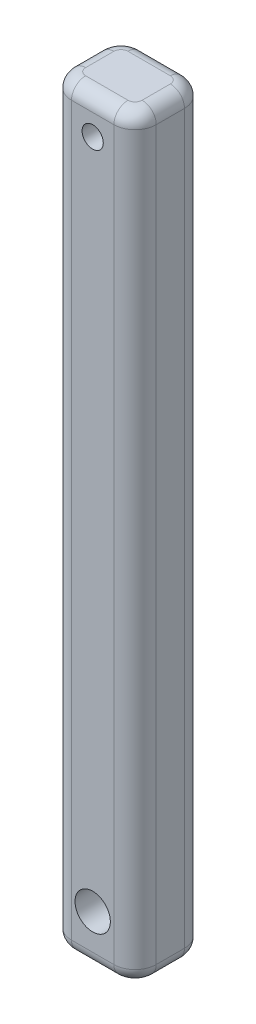
ISO-10303-21;
HEADER;
FILE_DESCRIPTION(('STEP AP214'),'2;1');
FILE_NAME('part.step','',(''),(''),'','','');
FILE_SCHEMA(('AUTOMOTIVE_DESIGN { 1 0 10303 214 1 1 1 1 }'));
ENDSEC;
DATA;
#1=APPLICATION_CONTEXT('core data for automotive mechanical design processes');
#2=APPLICATION_PROTOCOL_DEFINITION('international standard','automotive_design',2000,#1);
#3=PRODUCT_CONTEXT('',#1,'mechanical');
#4=PRODUCT('Part','Part','',(#3));
#5=PRODUCT_RELATED_PRODUCT_CATEGORY('part','',(#4));
#6=PRODUCT_DEFINITION_FORMATION('','',#4);
#7=PRODUCT_DEFINITION_CONTEXT('part definition',#1,'design');
#8=PRODUCT_DEFINITION('design','',#6,#7);
#9=PRODUCT_DEFINITION_SHAPE('','',#8);
#10=(LENGTH_UNIT() NAMED_UNIT(*) SI_UNIT(.MILLI.,.METRE.));
#11=(NAMED_UNIT(*) PLANE_ANGLE_UNIT() SI_UNIT($,.RADIAN.));
#12=(NAMED_UNIT(*) SI_UNIT($,.STERADIAN.) SOLID_ANGLE_UNIT());
#13=UNCERTAINTY_MEASURE_WITH_UNIT(LENGTH_MEASURE(1.E-05),#10,'distance_accuracy_value','');
#14=(GEOMETRIC_REPRESENTATION_CONTEXT(3) GLOBAL_UNCERTAINTY_ASSIGNED_CONTEXT((#13)) GLOBAL_UNIT_ASSIGNED_CONTEXT((#10,
#11,#12)) REPRESENTATION_CONTEXT('',''));
#15=CARTESIAN_POINT('',(0.,0.,0.));
#16=DIRECTION('',(0.,0.,1.));
#17=DIRECTION('',(1.,0.,0.));
#18=AXIS2_PLACEMENT_3D('',#15,#16,#17);
#19=CARTESIAN_POINT('',(-7.61999999999996,271.78,5.08));
#20=DIRECTION('',(0.,-1.,0.));
#21=DIRECTION('',(0.,0.,-1.));
#22=AXIS2_PLACEMENT_3D('',#19,#20,#21);
#23=CYLINDRICAL_SURFACE('',#22,7.62);
#24=DIRECTION('',(0.,-1.,0.));
#25=VECTOR('',#24,1.);
#26=CARTESIAN_POINT('',(-15.24,271.78,5.08));
#27=LINE('',#26,#25);
#28=CARTESIAN_POINT('',(-15.24,266.7,5.08));
#29=VERTEX_POINT('',#28);
#30=CARTESIAN_POINT('',(-15.24,5.07999999999997,5.08));
#31=VERTEX_POINT('',#30);
#32=EDGE_CURVE('E302',#29,#31,#27,.T.);
#33=ORIENTED_EDGE('',*,*,#32,.T.);
#34=CARTESIAN_POINT('',(-7.61999999999996,5.07999999999997,5.08));
#35=DIRECTION('',(0.,1.,0.));
#36=DIRECTION('',(0.,0.,1.));
#37=AXIS2_PLACEMENT_3D('',#34,#35,#36);
#38=CIRCLE('',#37,7.62);
#39=CARTESIAN_POINT('',(-7.61999999999996,5.07999999999997,12.7));
#40=VERTEX_POINT('',#39);
#41=EDGE_CURVE('E13',#31,#40,#38,.T.);
#42=ORIENTED_EDGE('',*,*,#41,.T.);
#43=DIRECTION('',(0.,-1.,0.));
#44=VECTOR('',#43,1.);
#45=CARTESIAN_POINT('',(-7.61999999999996,271.78,12.7));
#46=LINE('',#45,#44);
#47=CARTESIAN_POINT('',(-7.61999999999996,266.7,12.7));
#48=VERTEX_POINT('',#47);
#49=EDGE_CURVE('E182',#48,#40,#46,.T.);
#50=ORIENTED_EDGE('',*,*,#49,.F.);
#51=CARTESIAN_POINT('',(-7.61999999999996,266.7,5.08));
#52=DIRECTION('',(0.,1.,0.));
#53=DIRECTION('',(0.,0.,1.));
#54=AXIS2_PLACEMENT_3D('',#51,#52,#53);
#55=CIRCLE('',#54,7.62);
#56=EDGE_CURVE('E206',#48,#29,#55,.F.);
#57=ORIENTED_EDGE('',*,*,#56,.T.);
#58=EDGE_LOOP('',(#33,#42,#50,#57));
#59=FACE_BOUND('',#58,.T.);
#60=ADVANCED_FACE('F46',(#59),#23,.T.);
#61=CARTESIAN_POINT('',(-7.61999999999996,271.78,12.7));
#62=DIRECTION('',(0.,0.,-1.));
#63=DIRECTION('',(-1.,0.,0.));
#64=AXIS2_PLACEMENT_3D('',#61,#62,#63);
#65=PLANE('',#64);
#66=CARTESIAN_POINT('',(0.,259.08,12.7));
#67=DIRECTION('',(0.,0.,1.));
#68=DIRECTION('',(1.,0.,0.));
#69=AXIS2_PLACEMENT_3D('',#66,#67,#68);
#70=CIRCLE('',#69,3.81);
#71=CARTESIAN_POINT('',(3.81,259.08,12.7));
#72=VERTEX_POINT('',#71);
#73=EDGE_CURVE('E226',#72,#72,#70,.T.);
#74=ORIENTED_EDGE('',*,*,#73,.F.);
#75=EDGE_LOOP('',(#74));
#76=FACE_BOUND('',#75,.T.);
#77=CARTESIAN_POINT('',(0.,17.78,12.7));
#78=DIRECTION('',(0.,0.,1.));
#79=DIRECTION('',(1.,0.,0.));
#80=AXIS2_PLACEMENT_3D('',#77,#78,#79);
#81=CIRCLE('',#80,6.35);
#82=CARTESIAN_POINT('',(6.35,17.78,12.7));
#83=VERTEX_POINT('',#82);
#84=EDGE_CURVE('E449',#83,#83,#81,.T.);
#85=ORIENTED_EDGE('',*,*,#84,.F.);
#86=EDGE_LOOP('',(#85));
#87=FACE_BOUND('',#86,.T.);
#88=ORIENTED_EDGE('',*,*,#49,.T.);
#89=DIRECTION('',(1.,0.,0.));
#90=VECTOR('',#89,1.);
#91=CARTESIAN_POINT('',(-7.61999999999996,5.07999999999997,12.7));
#92=LINE('',#91,#90);
#93=CARTESIAN_POINT('',(7.61999999999996,5.07999999999997,12.7));
#94=VERTEX_POINT('',#93);
#95=EDGE_CURVE('E207',#40,#94,#92,.T.);
#96=ORIENTED_EDGE('',*,*,#95,.T.);
#97=DIRECTION('',(0.,-1.,0.));
#98=VECTOR('',#97,1.);
#99=CARTESIAN_POINT('',(7.61999999999996,271.78,12.7));
#100=LINE('',#99,#98);
#101=CARTESIAN_POINT('',(7.61999999999996,266.7,12.7));
#102=VERTEX_POINT('',#101);
#103=EDGE_CURVE('E308',#102,#94,#100,.T.);
#104=ORIENTED_EDGE('',*,*,#103,.F.);
#105=DIRECTION('',(1.,0.,0.));
#106=VECTOR('',#105,1.);
#107=CARTESIAN_POINT('',(-7.61999999999996,266.7,12.7));
#108=LINE('',#107,#106);
#109=EDGE_CURVE('E204',#102,#48,#108,.F.);
#110=ORIENTED_EDGE('',*,*,#109,.T.);
#111=EDGE_LOOP('',(#88,#96,#104,#110));
#112=FACE_BOUND('',#111,.T.);
#113=ADVANCED_FACE('F304',(#76,#87,#112),#65,.F.);
#114=CARTESIAN_POINT('',(7.61999999999996,271.78,5.08));
#115=DIRECTION('',(0.,-1.,0.));
#116=DIRECTION('',(0.,0.,-1.));
#117=AXIS2_PLACEMENT_3D('',#114,#115,#116);
#118=CYLINDRICAL_SURFACE('',#117,7.62);
#119=ORIENTED_EDGE('',*,*,#103,.T.);
#120=CARTESIAN_POINT('',(7.61999999999996,5.07999999999997,5.08));
#121=DIRECTION('',(0.,1.,0.));
#122=DIRECTION('',(0.,0.,1.));
#123=AXIS2_PLACEMENT_3D('',#120,#121,#122);
#124=CIRCLE('',#123,7.62);
#125=CARTESIAN_POINT('',(15.2399999999999,5.07999999999997,5.08));
#126=VERTEX_POINT('',#125);
#127=EDGE_CURVE('E246',#94,#126,#124,.T.);
#128=ORIENTED_EDGE('',*,*,#127,.T.);
#129=DIRECTION('',(0.,-1.,0.));
#130=VECTOR('',#129,1.);
#131=CARTESIAN_POINT('',(15.2399999999999,271.78,5.08));
#132=LINE('',#131,#130);
#133=CARTESIAN_POINT('',(15.2399999999999,266.7,5.08));
#134=VERTEX_POINT('',#133);
#135=EDGE_CURVE('E310',#134,#126,#132,.T.);
#136=ORIENTED_EDGE('',*,*,#135,.F.);
#137=CARTESIAN_POINT('',(7.61999999999996,266.7,5.08));
#138=DIRECTION('',(0.,1.,0.));
#139=DIRECTION('',(0.,0.,1.));
#140=AXIS2_PLACEMENT_3D('',#137,#138,#139);
#141=CIRCLE('',#140,7.62);
#142=EDGE_CURVE('E202',#134,#102,#141,.F.);
#143=ORIENTED_EDGE('',*,*,#142,.T.);
#144=EDGE_LOOP('',(#119,#128,#136,#143));
#145=FACE_BOUND('',#144,.T.);
#146=ADVANCED_FACE('F379',(#145),#118,.T.);
#147=CARTESIAN_POINT('',(15.2399999999999,271.78,-5.08));
#148=DIRECTION('',(-1.,0.,0.));
#149=DIRECTION('',(0.,0.,1.));
#150=AXIS2_PLACEMENT_3D('',#147,#148,#149);
#151=PLANE('',#150);
#152=ORIENTED_EDGE('',*,*,#135,.T.);
#153=DIRECTION('',(0.,0.,-1.));
#154=VECTOR('',#153,1.);
#155=CARTESIAN_POINT('',(15.2399999999999,5.07999999999997,-5.08));
#156=LINE('',#155,#154);
#157=CARTESIAN_POINT('',(15.2399999999999,5.07999999999997,-5.08));
#158=VERTEX_POINT('',#157);
#159=EDGE_CURVE('E248',#126,#158,#156,.T.);
#160=ORIENTED_EDGE('',*,*,#159,.T.);
#161=DIRECTION('',(0.,-1.,0.));
#162=VECTOR('',#161,1.);
#163=CARTESIAN_POINT('',(15.2399999999999,271.78,-5.08));
#164=LINE('',#163,#162);
#165=CARTESIAN_POINT('',(15.2399999999999,266.7,-5.08));
#166=VERTEX_POINT('',#165);
#167=EDGE_CURVE('E344',#166,#158,#164,.T.);
#168=ORIENTED_EDGE('',*,*,#167,.F.);
#169=DIRECTION('',(0.,0.,-1.));
#170=VECTOR('',#169,1.);
#171=CARTESIAN_POINT('',(15.2399999999999,266.7,5.08));
#172=LINE('',#171,#170);
#173=EDGE_CURVE('E200',#166,#134,#172,.F.);
#174=ORIENTED_EDGE('',*,*,#173,.T.);
#175=EDGE_LOOP('',(#152,#160,#168,#174));
#176=FACE_BOUND('',#175,.T.);
#177=ADVANCED_FACE('F350',(#176),#151,.F.);
#178=CARTESIAN_POINT('',(7.61999999999996,271.78,-5.08));
#179=DIRECTION('',(0.,-1.,0.));
#180=DIRECTION('',(0.,0.,-1.));
#181=AXIS2_PLACEMENT_3D('',#178,#179,#180);
#182=CYLINDRICAL_SURFACE('',#181,7.62);
#183=ORIENTED_EDGE('',*,*,#167,.T.);
#184=CARTESIAN_POINT('',(7.61999999999996,5.07999999999997,-5.08));
#185=DIRECTION('',(0.,1.,0.));
#186=DIRECTION('',(0.,0.,1.));
#187=AXIS2_PLACEMENT_3D('',#184,#185,#186);
#188=CIRCLE('',#187,7.62);
#189=CARTESIAN_POINT('',(7.61999999999996,5.07999999999997,-12.7));
#190=VERTEX_POINT('',#189);
#191=EDGE_CURVE('E250',#158,#190,#188,.T.);
#192=ORIENTED_EDGE('',*,*,#191,.T.);
#193=DIRECTION('',(0.,-1.,0.));
#194=VECTOR('',#193,1.);
#195=CARTESIAN_POINT('',(7.61999999999996,271.78,-12.7));
#196=LINE('',#195,#194);
#197=CARTESIAN_POINT('',(7.61999999999996,266.7,-12.7));
#198=VERTEX_POINT('',#197);
#199=EDGE_CURVE('E336',#198,#190,#196,.T.);
#200=ORIENTED_EDGE('',*,*,#199,.F.);
#201=CARTESIAN_POINT('',(7.61999999999996,266.7,-5.08));
#202=DIRECTION('',(0.,1.,0.));
#203=DIRECTION('',(0.,0.,1.));
#204=AXIS2_PLACEMENT_3D('',#201,#202,#203);
#205=CIRCLE('',#204,7.62);
#206=EDGE_CURVE('E198',#198,#166,#205,.F.);
#207=ORIENTED_EDGE('',*,*,#206,.T.);
#208=EDGE_LOOP('',(#183,#192,#200,#207));
#209=FACE_BOUND('',#208,.T.);
#210=ADVANCED_FACE('F422',(#209),#182,.T.);
#211=CARTESIAN_POINT('',(-7.61999999999996,271.78,-12.7));
#212=DIRECTION('',(0.,0.,1.));
#213=DIRECTION('',(1.,0.,0.));
#214=AXIS2_PLACEMENT_3D('',#211,#212,#213);
#215=PLANE('',#214);
#216=CARTESIAN_POINT('',(0.,259.08,-12.7));
#217=DIRECTION('',(0.,0.,1.));
#218=DIRECTION('',(1.,0.,0.));
#219=AXIS2_PLACEMENT_3D('',#216,#217,#218);
#220=CIRCLE('',#219,3.81);
#221=CARTESIAN_POINT('',(3.81,259.08,-12.7));
#222=VERTEX_POINT('',#221);
#223=EDGE_CURVE('E451',#222,#222,#220,.T.);
#224=ORIENTED_EDGE('',*,*,#223,.T.);
#225=EDGE_LOOP('',(#224));
#226=FACE_BOUND('',#225,.T.);
#227=CARTESIAN_POINT('',(0.,17.78,-12.7));
#228=DIRECTION('',(0.,0.,1.));
#229=DIRECTION('',(1.,0.,0.));
#230=AXIS2_PLACEMENT_3D('',#227,#228,#229);
#231=CIRCLE('',#230,6.35);
#232=CARTESIAN_POINT('',(6.35,17.78,-12.7));
#233=VERTEX_POINT('',#232);
#234=EDGE_CURVE('E338',#233,#233,#231,.T.);
#235=ORIENTED_EDGE('',*,*,#234,.T.);
#236=EDGE_LOOP('',(#235));
#237=FACE_BOUND('',#236,.T.);
#238=ORIENTED_EDGE('',*,*,#199,.T.);
#239=DIRECTION('',(-1.,0.,0.));
#240=VECTOR('',#239,1.);
#241=CARTESIAN_POINT('',(-7.61999999999996,5.07999999999997,-12.7));
#242=LINE('',#241,#240);
#243=CARTESIAN_POINT('',(-7.61999999999996,5.07999999999997,-12.7));
#244=VERTEX_POINT('',#243);
#245=EDGE_CURVE('E252',#190,#244,#242,.T.);
#246=ORIENTED_EDGE('',*,*,#245,.T.);
#247=DIRECTION('',(0.,-1.,0.));
#248=VECTOR('',#247,1.);
#249=CARTESIAN_POINT('',(-7.61999999999996,271.78,-12.7));
#250=LINE('',#249,#248);
#251=CARTESIAN_POINT('',(-7.61999999999996,266.7,-12.7));
#252=VERTEX_POINT('',#251);
#253=EDGE_CURVE('E334',#252,#244,#250,.T.);
#254=ORIENTED_EDGE('',*,*,#253,.F.);
#255=DIRECTION('',(-1.,0.,0.));
#256=VECTOR('',#255,1.);
#257=CARTESIAN_POINT('',(7.61999999999996,266.7,-12.7));
#258=LINE('',#257,#256);
#259=EDGE_CURVE('E196',#252,#198,#258,.F.);
#260=ORIENTED_EDGE('',*,*,#259,.T.);
#261=EDGE_LOOP('',(#238,#246,#254,#260));
#262=FACE_BOUND('',#261,.T.);
#263=ADVANCED_FACE('F427',(#226,#237,#262),#215,.F.);
#264=CARTESIAN_POINT('',(-7.61999999999996,271.78,-5.08));
#265=DIRECTION('',(0.,-1.,0.));
#266=DIRECTION('',(0.,0.,-1.));
#267=AXIS2_PLACEMENT_3D('',#264,#265,#266);
#268=CYLINDRICAL_SURFACE('',#267,7.62);
#269=ORIENTED_EDGE('',*,*,#253,.T.);
#270=CARTESIAN_POINT('',(-7.61999999999996,5.07999999999997,-5.08));
#271=DIRECTION('',(0.,1.,0.));
#272=DIRECTION('',(0.,0.,1.));
#273=AXIS2_PLACEMENT_3D('',#270,#271,#272);
#274=CIRCLE('',#273,7.62);
#275=CARTESIAN_POINT('',(-15.24,5.07999999999997,-5.08));
#276=VERTEX_POINT('',#275);
#277=EDGE_CURVE('E70',#244,#276,#274,.T.);
#278=ORIENTED_EDGE('',*,*,#277,.T.);
#279=DIRECTION('',(0.,-1.,0.));
#280=VECTOR('',#279,1.);
#281=CARTESIAN_POINT('',(-15.24,271.78,-5.08));
#282=LINE('',#281,#280);
#283=CARTESIAN_POINT('',(-15.24,266.7,-5.08));
#284=VERTEX_POINT('',#283);
#285=EDGE_CURVE('E332',#284,#276,#282,.T.);
#286=ORIENTED_EDGE('',*,*,#285,.F.);
#287=CARTESIAN_POINT('',(-7.61999999999996,266.7,-5.08));
#288=DIRECTION('',(0.,1.,0.));
#289=DIRECTION('',(0.,0.,1.));
#290=AXIS2_PLACEMENT_3D('',#287,#288,#289);
#291=CIRCLE('',#290,7.62);
#292=EDGE_CURVE('E189',#284,#252,#291,.F.);
#293=ORIENTED_EDGE('',*,*,#292,.T.);
#294=EDGE_LOOP('',(#269,#278,#286,#293));
#295=FACE_BOUND('',#294,.T.);
#296=ADVANCED_FACE('F333',(#295),#268,.T.);
#297=CARTESIAN_POINT('',(-15.24,271.78,-5.08));
#298=DIRECTION('',(1.,0.,0.));
#299=DIRECTION('',(0.,0.,-1.));
#300=AXIS2_PLACEMENT_3D('',#297,#298,#299);
#301=PLANE('',#300);
#302=ORIENTED_EDGE('',*,*,#285,.T.);
#303=DIRECTION('',(0.,0.,1.));
#304=VECTOR('',#303,1.);
#305=CARTESIAN_POINT('',(-15.24,5.07999999999997,-5.08));
#306=LINE('',#305,#304);
#307=EDGE_CURVE('E55',#276,#31,#306,.T.);
#308=ORIENTED_EDGE('',*,*,#307,.T.);
#309=ORIENTED_EDGE('',*,*,#32,.F.);
#310=DIRECTION('',(0.,0.,1.));
#311=VECTOR('',#310,1.);
#312=CARTESIAN_POINT('',(-15.24,266.7,-5.08));
#313=LINE('',#312,#311);
#314=EDGE_CURVE('E169',#29,#284,#313,.F.);
#315=ORIENTED_EDGE('',*,*,#314,.T.);
#316=EDGE_LOOP('',(#302,#308,#309,#315));
#317=FACE_BOUND('',#316,.T.);
#318=ADVANCED_FACE('F331',(#317),#301,.F.);
#319=CARTESIAN_POINT('',(-7.61999999999996,271.78,5.08));
#320=DIRECTION('',(0.,1.,0.));
#321=DIRECTION('',(0.,0.,1.));
#322=AXIS2_PLACEMENT_3D('',#319,#320,#321);
#323=PLANE('',#322);
#324=CARTESIAN_POINT('',(-7.61999999999996,271.78,-5.08));
#325=DIRECTION('',(0.,1.,0.));
#326=DIRECTION('',(0.,0.,1.));
#327=AXIS2_PLACEMENT_3D('',#324,#325,#326);
#328=CIRCLE('',#327,2.54);
#329=CARTESIAN_POINT('',(-7.61999999999996,271.78,-7.62));
#330=VERTEX_POINT('',#329);
#331=CARTESIAN_POINT('',(-10.1599999999999,271.78,-5.08));
#332=VERTEX_POINT('',#331);
#333=EDGE_CURVE('E186',#330,#332,#328,.T.);
#334=ORIENTED_EDGE('',*,*,#333,.T.);
#335=DIRECTION('',(0.,0.,1.));
#336=VECTOR('',#335,1.);
#337=CARTESIAN_POINT('',(-10.1599999999999,271.78,5.08));
#338=LINE('',#337,#336);
#339=CARTESIAN_POINT('',(-10.1599999999999,271.78,5.08));
#340=VERTEX_POINT('',#339);
#341=EDGE_CURVE('E167',#332,#340,#338,.T.);
#342=ORIENTED_EDGE('',*,*,#341,.T.);
#343=CARTESIAN_POINT('',(-7.61999999999996,271.78,5.08));
#344=DIRECTION('',(0.,1.,0.));
#345=DIRECTION('',(0.,0.,1.));
#346=AXIS2_PLACEMENT_3D('',#343,#344,#345);
#347=CIRCLE('',#346,2.54);
#348=CARTESIAN_POINT('',(-7.61999999999996,271.78,7.61999999999999));
#349=VERTEX_POINT('',#348);
#350=EDGE_CURVE('E175',#340,#349,#347,.T.);
#351=ORIENTED_EDGE('',*,*,#350,.T.);
#352=DIRECTION('',(1.,0.,0.));
#353=VECTOR('',#352,1.);
#354=CARTESIAN_POINT('',(7.61999999999996,271.78,7.61999999999999));
#355=LINE('',#354,#353);
#356=CARTESIAN_POINT('',(7.61999999999996,271.78,7.61999999999999));
#357=VERTEX_POINT('',#356);
#358=EDGE_CURVE('E181',#349,#357,#355,.T.);
#359=ORIENTED_EDGE('',*,*,#358,.T.);
#360=CARTESIAN_POINT('',(7.61999999999996,271.78,5.08));
#361=DIRECTION('',(0.,1.,0.));
#362=DIRECTION('',(0.,0.,1.));
#363=AXIS2_PLACEMENT_3D('',#360,#361,#362);
#364=CIRCLE('',#363,2.54);
#365=CARTESIAN_POINT('',(10.1599999999999,271.78,5.08));
#366=VERTEX_POINT('',#365);
#367=EDGE_CURVE('E315',#357,#366,#364,.T.);
#368=ORIENTED_EDGE('',*,*,#367,.T.);
#369=DIRECTION('',(0.,0.,-1.));
#370=VECTOR('',#369,1.);
#371=CARTESIAN_POINT('',(10.1599999999999,271.78,-5.08));
#372=LINE('',#371,#370);
#373=CARTESIAN_POINT('',(10.1599999999999,271.78,-5.08));
#374=VERTEX_POINT('',#373);
#375=EDGE_CURVE('E317',#366,#374,#372,.T.);
#376=ORIENTED_EDGE('',*,*,#375,.T.);
#377=CARTESIAN_POINT('',(7.61999999999996,271.78,-5.08));
#378=DIRECTION('',(0.,1.,0.));
#379=DIRECTION('',(0.,0.,1.));
#380=AXIS2_PLACEMENT_3D('',#377,#378,#379);
#381=CIRCLE('',#380,2.54);
#382=CARTESIAN_POINT('',(7.61999999999996,271.78,-7.62));
#383=VERTEX_POINT('',#382);
#384=EDGE_CURVE('E319',#374,#383,#381,.T.);
#385=ORIENTED_EDGE('',*,*,#384,.T.);
#386=DIRECTION('',(-1.,0.,0.));
#387=VECTOR('',#386,1.);
#388=CARTESIAN_POINT('',(-7.61999999999996,271.78,-7.62));
#389=LINE('',#388,#387);
#390=EDGE_CURVE('E191',#383,#330,#389,.T.);
#391=ORIENTED_EDGE('',*,*,#390,.T.);
#392=EDGE_LOOP('',(#334,#342,#351,#359,#368,#376,#385,#391));
#393=FACE_BOUND('',#392,.T.);
#394=ADVANCED_FACE('F184',(#393),#323,.T.);
#395=CARTESIAN_POINT('',(-7.61999999999996,0.,5.08));
#396=DIRECTION('',(0.,1.,0.));
#397=DIRECTION('',(0.,0.,1.));
#398=AXIS2_PLACEMENT_3D('',#395,#396,#397);
#399=PLANE('',#398);
#400=CARTESIAN_POINT('',(7.61999999999996,0.,5.08));
#401=DIRECTION('',(0.,1.,0.));
#402=DIRECTION('',(0.,0.,1.));
#403=AXIS2_PLACEMENT_3D('',#400,#401,#402);
#404=CIRCLE('',#403,2.54);
#405=CARTESIAN_POINT('',(10.1599999999999,0.,5.08));
#406=VERTEX_POINT('',#405);
#407=CARTESIAN_POINT('',(7.61999999999996,0.,7.61999999999999));
#408=VERTEX_POINT('',#407);
#409=EDGE_CURVE('E241',#406,#408,#404,.F.);
#410=ORIENTED_EDGE('',*,*,#409,.T.);
#411=DIRECTION('',(1.,0.,0.));
#412=VECTOR('',#411,1.);
#413=CARTESIAN_POINT('',(-7.61999999999996,0.,7.61999999999999));
#414=LINE('',#413,#412);
#415=CARTESIAN_POINT('',(-7.61999999999996,0.,7.61999999999999));
#416=VERTEX_POINT('',#415);
#417=EDGE_CURVE('E243',#408,#416,#414,.F.);
#418=ORIENTED_EDGE('',*,*,#417,.T.);
#419=CARTESIAN_POINT('',(-7.61999999999996,0.,5.08));
#420=DIRECTION('',(0.,1.,0.));
#421=DIRECTION('',(0.,0.,1.));
#422=AXIS2_PLACEMENT_3D('',#419,#420,#421);
#423=CIRCLE('',#422,2.54);
#424=CARTESIAN_POINT('',(-10.1599999999999,0.,5.08));
#425=VERTEX_POINT('',#424);
#426=EDGE_CURVE('E229',#416,#425,#423,.F.);
#427=ORIENTED_EDGE('',*,*,#426,.T.);
#428=DIRECTION('',(0.,0.,1.));
#429=VECTOR('',#428,1.);
#430=CARTESIAN_POINT('',(-10.1599999999999,0.,5.08));
#431=LINE('',#430,#429);
#432=CARTESIAN_POINT('',(-10.1599999999999,0.,-5.08));
#433=VERTEX_POINT('',#432);
#434=EDGE_CURVE('E231',#425,#433,#431,.F.);
#435=ORIENTED_EDGE('',*,*,#434,.T.);
#436=CARTESIAN_POINT('',(-7.61999999999996,0.,-5.08));
#437=DIRECTION('',(0.,1.,0.));
#438=DIRECTION('',(0.,0.,1.));
#439=AXIS2_PLACEMENT_3D('',#436,#437,#438);
#440=CIRCLE('',#439,2.54);
#441=CARTESIAN_POINT('',(-7.61999999999996,0.,-7.62));
#442=VERTEX_POINT('',#441);
#443=EDGE_CURVE('E233',#433,#442,#440,.F.);
#444=ORIENTED_EDGE('',*,*,#443,.T.);
#445=DIRECTION('',(-1.,0.,0.));
#446=VECTOR('',#445,1.);
#447=CARTESIAN_POINT('',(-7.61999999999996,0.,-7.62));
#448=LINE('',#447,#446);
#449=CARTESIAN_POINT('',(7.61999999999996,0.,-7.62));
#450=VERTEX_POINT('',#449);
#451=EDGE_CURVE('E235',#442,#450,#448,.F.);
#452=ORIENTED_EDGE('',*,*,#451,.T.);
#453=CARTESIAN_POINT('',(7.61999999999996,0.,-5.08));
#454=DIRECTION('',(0.,1.,0.));
#455=DIRECTION('',(0.,0.,1.));
#456=AXIS2_PLACEMENT_3D('',#453,#454,#455);
#457=CIRCLE('',#456,2.54);
#458=CARTESIAN_POINT('',(10.1599999999999,0.,-5.08));
#459=VERTEX_POINT('',#458);
#460=EDGE_CURVE('E237',#450,#459,#457,.F.);
#461=ORIENTED_EDGE('',*,*,#460,.T.);
#462=DIRECTION('',(0.,0.,-1.));
#463=VECTOR('',#462,1.);
#464=CARTESIAN_POINT('',(10.1599999999999,0.,5.08));
#465=LINE('',#464,#463);
#466=EDGE_CURVE('E239',#459,#406,#465,.F.);
#467=ORIENTED_EDGE('',*,*,#466,.T.);
#468=EDGE_LOOP('',(#410,#418,#427,#435,#444,#452,#461,#467));
#469=FACE_BOUND('',#468,.T.);
#470=ADVANCED_FACE('F287',(#469),#399,.F.);
#471=CARTESIAN_POINT('',(0.,17.78,-12.7));
#472=DIRECTION('',(0.,0.,1.));
#473=DIRECTION('',(1.,0.,0.));
#474=AXIS2_PLACEMENT_3D('',#471,#472,#473);
#475=CYLINDRICAL_SURFACE('',#474,6.35);
#476=CARTESIAN_POINT('',(6.35,17.78,-12.7));
#477=CARTESIAN_POINT('',(6.35,17.78,-12.4354166666667));
#478=CARTESIAN_POINT('',(6.35,17.78,-12.1708333333333));
#479=CARTESIAN_POINT('',(6.35,17.78,-11.6416666666667));
#480=CARTESIAN_POINT('',(6.35,17.78,-11.3770833333333));
#481=CARTESIAN_POINT('',(6.35,17.78,-10.8479166666667));
#482=CARTESIAN_POINT('',(6.35,17.78,-10.5833333333333));
#483=CARTESIAN_POINT('',(6.35,17.78,-10.0541666666667));
#484=CARTESIAN_POINT('',(6.35,17.78,-9.78958333333334));
#485=CARTESIAN_POINT('',(6.35,17.78,-9.26041666666667));
#486=CARTESIAN_POINT('',(6.35,17.78,-8.99583333333334));
#487=CARTESIAN_POINT('',(6.35,17.78,-8.46666666666667));
#488=CARTESIAN_POINT('',(6.35,17.78,-8.20208333333334));
#489=CARTESIAN_POINT('',(6.35,17.78,-7.67291666666667));
#490=CARTESIAN_POINT('',(6.35,17.78,-7.40833333333334));
#491=CARTESIAN_POINT('',(6.35,17.78,-6.87916666666667));
#492=CARTESIAN_POINT('',(6.35,17.78,-6.61458333333334));
#493=CARTESIAN_POINT('',(6.35,17.78,-6.08541666666667));
#494=CARTESIAN_POINT('',(6.35,17.78,-5.82083333333334));
#495=CARTESIAN_POINT('',(6.35,17.78,-5.29166666666667));
#496=CARTESIAN_POINT('',(6.35,17.78,-5.02708333333334));
#497=CARTESIAN_POINT('',(6.35,17.78,-4.49791666666668));
#498=CARTESIAN_POINT('',(6.35,17.78,-4.23333333333334));
#499=CARTESIAN_POINT('',(6.35,17.78,-3.70416666666668));
#500=CARTESIAN_POINT('',(6.35,17.78,-3.43958333333334));
#501=CARTESIAN_POINT('',(6.35,17.78,-2.91041666666668));
#502=CARTESIAN_POINT('',(6.35,17.78,-2.64583333333334));
#503=CARTESIAN_POINT('',(6.35,17.78,-2.11666666666668));
#504=CARTESIAN_POINT('',(6.35,17.78,-1.85208333333334));
#505=CARTESIAN_POINT('',(6.35,17.78,-1.32291666666668));
#506=CARTESIAN_POINT('',(6.35,17.78,-1.05833333333334));
#507=CARTESIAN_POINT('',(6.35,17.78,-0.529166666666677));
#508=CARTESIAN_POINT('',(6.35,17.78,-0.264583333333343));
#509=CARTESIAN_POINT('',(6.35,17.78,0.264583333333323));
#510=CARTESIAN_POINT('',(6.35,17.78,0.529166666666656));
#511=CARTESIAN_POINT('',(6.35,17.78,1.05833333333332));
#512=CARTESIAN_POINT('',(6.35,17.78,1.32291666666666));
#513=CARTESIAN_POINT('',(6.35,17.78,1.85208333333332));
#514=CARTESIAN_POINT('',(6.35,17.78,2.11666666666666));
#515=CARTESIAN_POINT('',(6.35,17.78,2.64583333333332));
#516=CARTESIAN_POINT('',(6.35,17.78,2.91041666666665));
#517=CARTESIAN_POINT('',(6.35,17.78,3.43958333333332));
#518=CARTESIAN_POINT('',(6.35,17.78,3.70416666666666));
#519=CARTESIAN_POINT('',(6.35,17.78,4.23333333333332));
#520=CARTESIAN_POINT('',(6.35,17.78,4.49791666666666));
#521=CARTESIAN_POINT('',(6.35,17.78,5.02708333333332));
#522=CARTESIAN_POINT('',(6.35,17.78,5.29166666666666));
#523=CARTESIAN_POINT('',(6.35,17.78,5.82083333333332));
#524=CARTESIAN_POINT('',(6.35,17.78,6.08541666666665));
#525=CARTESIAN_POINT('',(6.35,17.78,6.61458333333332));
#526=CARTESIAN_POINT('',(6.35,17.78,6.87916666666665));
#527=CARTESIAN_POINT('',(6.35,17.78,7.40833333333332));
#528=CARTESIAN_POINT('',(6.35,17.78,7.67291666666665));
#529=CARTESIAN_POINT('',(6.35,17.78,8.20208333333332));
#530=CARTESIAN_POINT('',(6.35,17.78,8.46666666666665));
#531=CARTESIAN_POINT('',(6.35,17.78,8.99583333333332));
#532=CARTESIAN_POINT('',(6.35,17.78,9.26041666666666));
#533=CARTESIAN_POINT('',(6.35,17.78,9.78958333333332));
#534=CARTESIAN_POINT('',(6.35,17.78,10.0541666666667));
#535=CARTESIAN_POINT('',(6.35,17.78,10.5833333333333));
#536=CARTESIAN_POINT('',(6.35,17.78,10.8479166666667));
#537=CARTESIAN_POINT('',(6.35,17.78,11.3770833333333));
#538=CARTESIAN_POINT('',(6.35,17.78,11.6416666666667));
#539=CARTESIAN_POINT('',(6.35,17.78,12.1708333333333));
#540=CARTESIAN_POINT('',(6.35,17.78,12.4354166666667));
#541=CARTESIAN_POINT('',(6.35,17.78,12.7));
#542=B_SPLINE_CURVE_WITH_KNOTS('',3,(#476,#477,#478,#479,#480,#481,#482,#483,#484,#485,#486,
#487,#488,#489,#490,#491,#492,#493,#494,#495,#496,#497,#498,#499,#500,#501,#502,#503,#504,#505,
#506,#507,#508,#509,#510,#511,#512,#513,#514,#515,#516,#517,#518,#519,#520,#521,#522,#523,#524,
#525,#526,#527,#528,#529,#530,#531,#532,#533,#534,#535,#536,#537,#538,#539,#540,#541),
.UNSPECIFIED.,.F.,.F.,(4,2,2,2,2,2,2,2,2,2,2,2,2,2,2,2,2,2,2,2,2,2,2,2,2,2,2,2,2,2,2,2,4),(0.,
0.793750000000001,1.5875,2.38125,3.175,3.96875,4.7625,5.55625,6.35,7.14375,7.93749999999999,
8.73125,9.525,10.31875,11.1125,11.90625,12.7,13.49375,14.2875,15.08125,15.875,16.66875,17.4625,
18.25625,19.05,19.84375,20.6375,21.43125,22.225,23.01875,23.8125,24.60625,25.4),.UNSPECIFIED.);
#543=EDGE_CURVE('BSEAM410',#233,#83,#542,.T.);
#544=ORIENTED_EDGE('',*,*,#234,.F.);
#545=ORIENTED_EDGE('',*,*,#84,.T.);
#546=ORIENTED_EDGE('',*,*,#543,.T.);
#547=ORIENTED_EDGE('',*,*,#543,.F.);
#548=EDGE_LOOP('',(#544,#546,#545,#547));
#549=FACE_BOUND('',#548,.T.);
#550=ADVANCED_FACE('F410',(#549),#475,.F.);
#551=CARTESIAN_POINT('',(0.,259.08,-12.7));
#552=DIRECTION('',(0.,0.,1.));
#553=DIRECTION('',(1.,0.,0.));
#554=AXIS2_PLACEMENT_3D('',#551,#552,#553);
#555=CYLINDRICAL_SURFACE('',#554,3.81);
#556=ORIENTED_EDGE('',*,*,#223,.F.);
#557=EDGE_LOOP('',(#556));
#558=FACE_BOUND('',#557,.T.);
#559=ORIENTED_EDGE('',*,*,#73,.T.);
#560=EDGE_LOOP('',(#559));
#561=FACE_BOUND('',#560,.T.);
#562=ADVANCED_FACE('F405',(#558,#561),#555,.F.);
#563=CARTESIAN_POINT('',(10.1599999999999,266.7,5.08));
#564=DIRECTION('',(0.,0.,1.));
#565=DIRECTION('',(1.,0.,0.));
#566=AXIS2_PLACEMENT_3D('',#563,#564,#565);
#567=CYLINDRICAL_SURFACE('',#566,5.08);
#568=CARTESIAN_POINT('',(10.1599999999999,266.7,5.08));
#569=DIRECTION('',(0.,0.,1.));
#570=DIRECTION('',(1.,0.,0.));
#571=AXIS2_PLACEMENT_3D('',#568,#569,#570);
#572=CIRCLE('',#571,5.08);
#573=EDGE_CURVE('E220',#134,#366,#572,.T.);
#574=ORIENTED_EDGE('',*,*,#573,.F.);
#575=ORIENTED_EDGE('',*,*,#173,.F.);
#576=CARTESIAN_POINT('',(10.1599999999999,266.7,-5.08));
#577=DIRECTION('',(0.,0.,-1.));
#578=DIRECTION('',(-1.,0.,0.));
#579=AXIS2_PLACEMENT_3D('',#576,#577,#578);
#580=CIRCLE('',#579,5.08);
#581=EDGE_CURVE('E223',#374,#166,#580,.T.);
#582=ORIENTED_EDGE('',*,*,#581,.F.);
#583=ORIENTED_EDGE('',*,*,#375,.F.);
#584=EDGE_LOOP('',(#574,#575,#582,#583));
#585=FACE_BOUND('',#584,.T.);
#586=ADVANCED_FACE('F402',(#585),#567,.T.);
#587=CARTESIAN_POINT('',(7.61999999999996,266.7,-5.08));
#588=DIRECTION('',(0.,1.,0.));
#589=DIRECTION('',(0.,0.,1.));
#590=AXIS2_PLACEMENT_3D('',#587,#588,#589);
#591=DEGENERATE_TOROIDAL_SURFACE('',#590,2.54,5.08,.T.);
#592=ORIENTED_EDGE('',*,*,#581,.T.);
#593=ORIENTED_EDGE('',*,*,#206,.F.);
#594=CARTESIAN_POINT('',(7.61999999999996,266.7,-7.62));
#595=DIRECTION('',(-1.,0.,0.));
#596=DIRECTION('',(0.,0.,1.));
#597=AXIS2_PLACEMENT_3D('',#594,#595,#596);
#598=CIRCLE('',#597,5.08);
#599=EDGE_CURVE('E217',#383,#198,#598,.T.);
#600=ORIENTED_EDGE('',*,*,#599,.F.);
#601=ORIENTED_EDGE('',*,*,#384,.F.);
#602=EDGE_LOOP('',(#592,#593,#600,#601));
#603=FACE_BOUND('',#602,.T.);
#604=ADVANCED_FACE('F399',(#603),#591,.T.);
#605=CARTESIAN_POINT('',(7.61999999999996,266.7,5.08));
#606=DIRECTION('',(0.,1.,0.));
#607=DIRECTION('',(0.,0.,1.));
#608=AXIS2_PLACEMENT_3D('',#605,#606,#607);
#609=DEGENERATE_TOROIDAL_SURFACE('',#608,2.54,5.08,.T.);
#610=ORIENTED_EDGE('',*,*,#573,.T.);
#611=ORIENTED_EDGE('',*,*,#367,.F.);
#612=CARTESIAN_POINT('',(7.61999999999996,266.7,7.61999999999999));
#613=DIRECTION('',(-1.,0.,0.));
#614=DIRECTION('',(0.,0.,1.));
#615=AXIS2_PLACEMENT_3D('',#612,#613,#614);
#616=CIRCLE('',#615,5.08);
#617=EDGE_CURVE('E214',#102,#357,#616,.T.);
#618=ORIENTED_EDGE('',*,*,#617,.F.);
#619=ORIENTED_EDGE('',*,*,#142,.F.);
#620=EDGE_LOOP('',(#610,#611,#618,#619));
#621=FACE_BOUND('',#620,.T.);
#622=ADVANCED_FACE('F396',(#621),#609,.T.);
#623=CARTESIAN_POINT('',(-7.61999999999996,266.7,-7.62));
#624=DIRECTION('',(1.,0.,0.));
#625=DIRECTION('',(0.,0.,-1.));
#626=AXIS2_PLACEMENT_3D('',#623,#624,#625);
#627=CYLINDRICAL_SURFACE('',#626,5.08);
#628=ORIENTED_EDGE('',*,*,#599,.T.);
#629=ORIENTED_EDGE('',*,*,#259,.F.);
#630=CARTESIAN_POINT('',(-7.61999999999996,266.7,-7.62));
#631=DIRECTION('',(-1.,0.,0.));
#632=DIRECTION('',(0.,0.,1.));
#633=AXIS2_PLACEMENT_3D('',#630,#631,#632);
#634=CIRCLE('',#633,5.08);
#635=EDGE_CURVE('E211',#330,#252,#634,.T.);
#636=ORIENTED_EDGE('',*,*,#635,.F.);
#637=ORIENTED_EDGE('',*,*,#390,.F.);
#638=EDGE_LOOP('',(#628,#629,#636,#637));
#639=FACE_BOUND('',#638,.T.);
#640=ADVANCED_FACE('F326',(#639),#627,.T.);
#641=CARTESIAN_POINT('',(-7.61999999999996,266.7,7.61999999999999));
#642=DIRECTION('',(-1.,0.,0.));
#643=DIRECTION('',(0.,0.,1.));
#644=AXIS2_PLACEMENT_3D('',#641,#642,#643);
#645=CYLINDRICAL_SURFACE('',#644,5.08);
#646=ORIENTED_EDGE('',*,*,#617,.T.);
#647=ORIENTED_EDGE('',*,*,#358,.F.);
#648=CARTESIAN_POINT('',(-7.61999999999996,266.7,7.61999999999999));
#649=DIRECTION('',(-1.,0.,0.));
#650=DIRECTION('',(0.,0.,1.));
#651=AXIS2_PLACEMENT_3D('',#648,#649,#650);
#652=CIRCLE('',#651,5.08);
#653=EDGE_CURVE('E178',#48,#349,#652,.T.);
#654=ORIENTED_EDGE('',*,*,#653,.F.);
#655=ORIENTED_EDGE('',*,*,#109,.F.);
#656=EDGE_LOOP('',(#646,#647,#654,#655));
#657=FACE_BOUND('',#656,.T.);
#658=ADVANCED_FACE('F390',(#657),#645,.T.);
#659=CARTESIAN_POINT('',(-7.61999999999996,266.7,-5.08));
#660=DIRECTION('',(0.,1.,0.));
#661=DIRECTION('',(0.,0.,1.));
#662=AXIS2_PLACEMENT_3D('',#659,#660,#661);
#663=DEGENERATE_TOROIDAL_SURFACE('',#662,2.54,5.08,.T.);
#664=ORIENTED_EDGE('',*,*,#635,.T.);
#665=ORIENTED_EDGE('',*,*,#292,.F.);
#666=CARTESIAN_POINT('',(-10.1599999999999,266.7,-5.08));
#667=DIRECTION('',(0.,0.,1.));
#668=DIRECTION('',(1.,0.,0.));
#669=AXIS2_PLACEMENT_3D('',#666,#667,#668);
#670=CIRCLE('',#669,5.08);
#671=EDGE_CURVE('E172',#332,#284,#670,.T.);
#672=ORIENTED_EDGE('',*,*,#671,.F.);
#673=ORIENTED_EDGE('',*,*,#333,.F.);
#674=EDGE_LOOP('',(#664,#665,#672,#673));
#675=FACE_BOUND('',#674,.T.);
#676=ADVANCED_FACE('F329',(#675),#663,.T.);
#677=CARTESIAN_POINT('',(-7.61999999999996,266.7,5.08));
#678=DIRECTION('',(0.,1.,0.));
#679=DIRECTION('',(0.,0.,1.));
#680=AXIS2_PLACEMENT_3D('',#677,#678,#679);
#681=DEGENERATE_TOROIDAL_SURFACE('',#680,2.54,5.08,.T.);
#682=ORIENTED_EDGE('',*,*,#653,.T.);
#683=ORIENTED_EDGE('',*,*,#350,.F.);
#684=CARTESIAN_POINT('',(-10.1599999999999,266.7,5.08));
#685=DIRECTION('',(0.,0.,-1.));
#686=DIRECTION('',(-1.,0.,0.));
#687=AXIS2_PLACEMENT_3D('',#684,#685,#686);
#688=CIRCLE('',#687,5.08);
#689=EDGE_CURVE('E163',#29,#340,#688,.T.);
#690=ORIENTED_EDGE('',*,*,#689,.F.);
#691=ORIENTED_EDGE('',*,*,#56,.F.);
#692=EDGE_LOOP('',(#682,#683,#690,#691));
#693=FACE_BOUND('',#692,.T.);
#694=ADVANCED_FACE('F176',(#693),#681,.T.);
#695=CARTESIAN_POINT('',(-10.1599999999999,266.7,5.08));
#696=DIRECTION('',(0.,0.,-1.));
#697=DIRECTION('',(-1.,0.,0.));
#698=AXIS2_PLACEMENT_3D('',#695,#696,#697);
#699=CYLINDRICAL_SURFACE('',#698,5.08);
#700=ORIENTED_EDGE('',*,*,#671,.T.);
#701=ORIENTED_EDGE('',*,*,#314,.F.);
#702=ORIENTED_EDGE('',*,*,#689,.T.);
#703=ORIENTED_EDGE('',*,*,#341,.F.);
#704=EDGE_LOOP('',(#700,#701,#702,#703));
#705=FACE_BOUND('',#704,.T.);
#706=ADVANCED_FACE('F165',(#705),#699,.T.);
#707=CARTESIAN_POINT('',(-7.61999999999996,5.07999999999997,-7.62));
#708=DIRECTION('',(-1.,0.,0.));
#709=DIRECTION('',(0.,0.,1.));
#710=AXIS2_PLACEMENT_3D('',#707,#708,#709);
#711=CYLINDRICAL_SURFACE('',#710,5.08);
#712=CARTESIAN_POINT('',(7.61999999999996,5.08,-7.62));
#713=DIRECTION('',(1.,0.,0.));
#714=DIRECTION('',(0.,0.,-1.));
#715=AXIS2_PLACEMENT_3D('',#712,#713,#714);
#716=CIRCLE('',#715,5.08);
#717=EDGE_CURVE('E271',#450,#190,#716,.T.);
#718=ORIENTED_EDGE('',*,*,#717,.F.);
#719=ORIENTED_EDGE('',*,*,#451,.F.);
#720=CARTESIAN_POINT('',(-7.61999999999996,5.07999999999997,-7.62));
#721=DIRECTION('',(-1.,0.,0.));
#722=DIRECTION('',(0.,0.,1.));
#723=AXIS2_PLACEMENT_3D('',#720,#721,#722);
#724=CIRCLE('',#723,5.08);
#725=EDGE_CURVE('E50',#244,#442,#724,.T.);
#726=ORIENTED_EDGE('',*,*,#725,.F.);
#727=ORIENTED_EDGE('',*,*,#245,.F.);
#728=EDGE_LOOP('',(#718,#719,#726,#727));
#729=FACE_BOUND('',#728,.T.);
#730=ADVANCED_FACE('F48',(#729),#711,.T.);
#731=CARTESIAN_POINT('',(-7.61999999999996,5.07999999999997,-5.08));
#732=DIRECTION('',(0.,1.,0.));
#733=DIRECTION('',(0.,0.,1.));
#734=AXIS2_PLACEMENT_3D('',#731,#732,#733);
#735=DEGENERATE_TOROIDAL_SURFACE('',#734,2.54,5.08,.T.);
#736=ORIENTED_EDGE('',*,*,#725,.T.);
#737=ORIENTED_EDGE('',*,*,#443,.F.);
#738=CARTESIAN_POINT('',(-10.1599999999999,5.07999999999997,-5.08));
#739=DIRECTION('',(0.,0.,1.));
#740=DIRECTION('',(1.,0.,0.));
#741=AXIS2_PLACEMENT_3D('',#738,#739,#740);
#742=CIRCLE('',#741,5.08);
#743=EDGE_CURVE('E269',#276,#433,#742,.T.);
#744=ORIENTED_EDGE('',*,*,#743,.F.);
#745=ORIENTED_EDGE('',*,*,#277,.F.);
#746=EDGE_LOOP('',(#736,#737,#744,#745));
#747=FACE_BOUND('',#746,.T.);
#748=ADVANCED_FACE('F281',(#747),#735,.T.);
#749=CARTESIAN_POINT('',(7.61999999999996,5.07999999999997,-5.08));
#750=DIRECTION('',(0.,1.,0.));
#751=DIRECTION('',(0.,0.,1.));
#752=AXIS2_PLACEMENT_3D('',#749,#750,#751);
#753=DEGENERATE_TOROIDAL_SURFACE('',#752,2.54,5.08,.T.);
#754=ORIENTED_EDGE('',*,*,#717,.T.);
#755=ORIENTED_EDGE('',*,*,#191,.F.);
#756=CARTESIAN_POINT('',(10.1599999999999,5.08,-5.08));
#757=DIRECTION('',(0.,0.,1.));
#758=DIRECTION('',(1.,0.,0.));
#759=AXIS2_PLACEMENT_3D('',#756,#757,#758);
#760=CIRCLE('',#759,5.08);
#761=EDGE_CURVE('E266',#459,#158,#760,.T.);
#762=ORIENTED_EDGE('',*,*,#761,.F.);
#763=ORIENTED_EDGE('',*,*,#460,.F.);
#764=EDGE_LOOP('',(#754,#755,#762,#763));
#765=FACE_BOUND('',#764,.T.);
#766=ADVANCED_FACE('F464',(#765),#753,.T.);
#767=CARTESIAN_POINT('',(-10.1599999999999,5.07999999999997,-5.08));
#768=DIRECTION('',(0.,0.,1.));
#769=DIRECTION('',(1.,0.,0.));
#770=AXIS2_PLACEMENT_3D('',#767,#768,#769);
#771=CYLINDRICAL_SURFACE('',#770,5.08);
#772=ORIENTED_EDGE('',*,*,#743,.T.);
#773=ORIENTED_EDGE('',*,*,#434,.F.);
#774=CARTESIAN_POINT('',(-10.1599999999999,5.07999999999997,5.08));
#775=DIRECTION('',(0.,0.,1.));
#776=DIRECTION('',(1.,0.,0.));
#777=AXIS2_PLACEMENT_3D('',#774,#775,#776);
#778=CIRCLE('',#777,5.08);
#779=EDGE_CURVE('E263',#31,#425,#778,.T.);
#780=ORIENTED_EDGE('',*,*,#779,.F.);
#781=ORIENTED_EDGE('',*,*,#307,.F.);
#782=EDGE_LOOP('',(#772,#773,#780,#781));
#783=FACE_BOUND('',#782,.T.);
#784=ADVANCED_FACE('F293',(#783),#771,.T.);
#785=CARTESIAN_POINT('',(10.1599999999999,5.07999999999997,-5.08));
#786=DIRECTION('',(0.,0.,-1.));
#787=DIRECTION('',(-1.,0.,0.));
#788=AXIS2_PLACEMENT_3D('',#785,#786,#787);
#789=CYLINDRICAL_SURFACE('',#788,5.08);
#790=ORIENTED_EDGE('',*,*,#761,.T.);
#791=ORIENTED_EDGE('',*,*,#159,.F.);
#792=CARTESIAN_POINT('',(10.1599999999999,5.08,5.08));
#793=DIRECTION('',(0.,0.,1.));
#794=DIRECTION('',(1.,0.,0.));
#795=AXIS2_PLACEMENT_3D('',#792,#793,#794);
#796=CIRCLE('',#795,5.08);
#797=EDGE_CURVE('E260',#406,#126,#796,.T.);
#798=ORIENTED_EDGE('',*,*,#797,.F.);
#799=ORIENTED_EDGE('',*,*,#466,.F.);
#800=EDGE_LOOP('',(#790,#791,#798,#799));
#801=FACE_BOUND('',#800,.T.);
#802=ADVANCED_FACE('F357',(#801),#789,.T.);
#803=CARTESIAN_POINT('',(-7.61999999999996,5.07999999999997,5.08));
#804=DIRECTION('',(0.,1.,0.));
#805=DIRECTION('',(0.,0.,1.));
#806=AXIS2_PLACEMENT_3D('',#803,#804,#805);
#807=DEGENERATE_TOROIDAL_SURFACE('',#806,2.54,5.08,.T.);
#808=ORIENTED_EDGE('',*,*,#779,.T.);
#809=ORIENTED_EDGE('',*,*,#426,.F.);
#810=CARTESIAN_POINT('',(-7.61999999999996,5.07999999999997,7.61999999999999));
#811=DIRECTION('',(1.,0.,0.));
#812=DIRECTION('',(0.,0.,-1.));
#813=AXIS2_PLACEMENT_3D('',#810,#811,#812);
#814=CIRCLE('',#813,5.08);
#815=EDGE_CURVE('E258',#40,#416,#814,.T.);
#816=ORIENTED_EDGE('',*,*,#815,.F.);
#817=ORIENTED_EDGE('',*,*,#41,.F.);
#818=EDGE_LOOP('',(#808,#809,#816,#817));
#819=FACE_BOUND('',#818,.T.);
#820=ADVANCED_FACE('F296',(#819),#807,.T.);
#821=CARTESIAN_POINT('',(7.61999999999996,5.07999999999997,5.08));
#822=DIRECTION('',(0.,1.,0.));
#823=DIRECTION('',(0.,0.,1.));
#824=AXIS2_PLACEMENT_3D('',#821,#822,#823);
#825=DEGENERATE_TOROIDAL_SURFACE('',#824,2.54,5.08,.T.);
#826=ORIENTED_EDGE('',*,*,#797,.T.);
#827=ORIENTED_EDGE('',*,*,#127,.F.);
#828=CARTESIAN_POINT('',(7.61999999999996,5.08,7.61999999999999));
#829=DIRECTION('',(-1.,0.,0.));
#830=DIRECTION('',(0.,0.,1.));
#831=AXIS2_PLACEMENT_3D('',#828,#829,#830);
#832=CIRCLE('',#831,5.08);
#833=EDGE_CURVE('E256',#408,#94,#832,.T.);
#834=ORIENTED_EDGE('',*,*,#833,.F.);
#835=ORIENTED_EDGE('',*,*,#409,.F.);
#836=EDGE_LOOP('',(#826,#827,#834,#835));
#837=FACE_BOUND('',#836,.T.);
#838=ADVANCED_FACE('F362',(#837),#825,.T.);
#839=CARTESIAN_POINT('',(-7.61999999999996,5.07999999999997,7.61999999999999));
#840=DIRECTION('',(1.,0.,0.));
#841=DIRECTION('',(0.,0.,-1.));
#842=AXIS2_PLACEMENT_3D('',#839,#840,#841);
#843=CYLINDRICAL_SURFACE('',#842,5.08);
#844=ORIENTED_EDGE('',*,*,#815,.T.);
#845=ORIENTED_EDGE('',*,*,#417,.F.);
#846=ORIENTED_EDGE('',*,*,#833,.T.);
#847=ORIENTED_EDGE('',*,*,#95,.F.);
#848=EDGE_LOOP('',(#844,#845,#846,#847));
#849=FACE_BOUND('',#848,.T.);
#850=ADVANCED_FACE('F366',(#849),#843,.T.);
#851=CLOSED_SHELL('',(#60,#113,#146,#177,#210,#263,#296,#318,#394,#470,#550,#562,#586,#604,#622,
#640,#658,#676,#694,#706,#730,#748,#766,#784,#802,#820,#838,#850));
#852=MANIFOLD_SOLID_BREP('B2',#851);
#853=ADVANCED_BREP_SHAPE_REPRESENTATION('',(#18,#852),#14);
#854=SHAPE_DEFINITION_REPRESENTATION(#9,#853);
ENDSEC;
END-ISO-10303-21;
